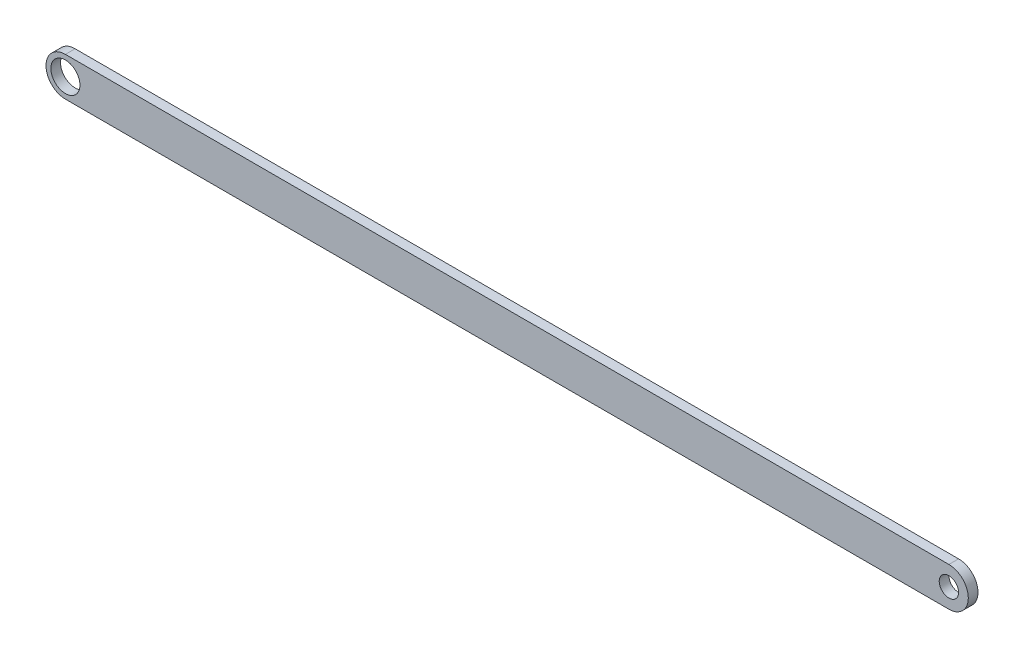
ISO-10303-21;
HEADER;
FILE_DESCRIPTION(('STEP AP214'),'2;1');
FILE_NAME('part.step','',(''),(''),'','','');
FILE_SCHEMA(('AUTOMOTIVE_DESIGN { 1 0 10303 214 1 1 1 1 }'));
ENDSEC;
DATA;
#1=APPLICATION_CONTEXT('core data for automotive mechanical design processes');
#2=APPLICATION_PROTOCOL_DEFINITION('international standard','automotive_design',2000,#1);
#3=PRODUCT_CONTEXT('',#1,'mechanical');
#4=PRODUCT('Part','Part','',(#3));
#5=PRODUCT_RELATED_PRODUCT_CATEGORY('part','',(#4));
#6=PRODUCT_DEFINITION_FORMATION('','',#4);
#7=PRODUCT_DEFINITION_CONTEXT('part definition',#1,'design');
#8=PRODUCT_DEFINITION('design','',#6,#7);
#9=PRODUCT_DEFINITION_SHAPE('','',#8);
#10=(LENGTH_UNIT() NAMED_UNIT(*) SI_UNIT(.MILLI.,.METRE.));
#11=(NAMED_UNIT(*) PLANE_ANGLE_UNIT() SI_UNIT($,.RADIAN.));
#12=(NAMED_UNIT(*) SI_UNIT($,.STERADIAN.) SOLID_ANGLE_UNIT());
#13=UNCERTAINTY_MEASURE_WITH_UNIT(LENGTH_MEASURE(1.E-05),#10,'distance_accuracy_value','');
#14=(GEOMETRIC_REPRESENTATION_CONTEXT(3) GLOBAL_UNCERTAINTY_ASSIGNED_CONTEXT((#13)) GLOBAL_UNIT_ASSIGNED_CONTEXT((#10,
#11,#12)) REPRESENTATION_CONTEXT('',''));
#15=CARTESIAN_POINT('',(0.,0.,0.));
#16=DIRECTION('',(0.,0.,1.));
#17=DIRECTION('',(1.,0.,0.));
#18=AXIS2_PLACEMENT_3D('',#15,#16,#17);
#19=CARTESIAN_POINT('',(45.545,0.,1.));
#20=DIRECTION('',(0.,0.,-1.));
#21=DIRECTION('',(-1.,0.,0.));
#22=AXIS2_PLACEMENT_3D('',#19,#20,#21);
#23=PLANE('',#22);
#24=CARTESIAN_POINT('',(45.545,0.,1.));
#25=DIRECTION('',(0.,0.,1.));
#26=DIRECTION('',(-1.,0.,0.));
#27=AXIS2_PLACEMENT_3D('',#24,#25,#26);
#28=CIRCLE('',#27,2.);
#29=CARTESIAN_POINT('',(45.5449999999999,-2.,1.));
#30=VERTEX_POINT('',#29);
#31=CARTESIAN_POINT('',(45.545,2.,1.));
#32=VERTEX_POINT('',#31);
#33=EDGE_CURVE('E89',#30,#32,#28,.T.);
#34=ORIENTED_EDGE('',*,*,#33,.T.);
#35=DIRECTION('',(-1.,0.,0.));
#36=VECTOR('',#35,1.);
#37=CARTESIAN_POINT('',(-45.545,2.,1.));
#38=LINE('',#37,#36);
#39=CARTESIAN_POINT('',(-45.545,2.,1.));
#40=VERTEX_POINT('',#39);
#41=EDGE_CURVE('E84',#32,#40,#38,.T.);
#42=ORIENTED_EDGE('',*,*,#41,.T.);
#43=CARTESIAN_POINT('',(-45.545,0.,1.));
#44=DIRECTION('',(0.,0.,1.));
#45=DIRECTION('',(1.,0.,0.));
#46=AXIS2_PLACEMENT_3D('',#43,#44,#45);
#47=CIRCLE('',#46,2.);
#48=CARTESIAN_POINT('',(-45.545,-2.,1.));
#49=VERTEX_POINT('',#48);
#50=EDGE_CURVE('E87',#40,#49,#47,.T.);
#51=ORIENTED_EDGE('',*,*,#50,.T.);
#52=DIRECTION('',(1.,0.,0.));
#53=VECTOR('',#52,1.);
#54=CARTESIAN_POINT('',(-45.545,-2.,1.));
#55=LINE('',#54,#53);
#56=EDGE_CURVE('E54',#49,#30,#55,.T.);
#57=ORIENTED_EDGE('',*,*,#56,.T.);
#58=EDGE_LOOP('',(#34,#42,#51,#57));
#59=FACE_BOUND('',#58,.T.);
#60=CARTESIAN_POINT('',(-45.545,0.,1.));
#61=DIRECTION('',(0.,0.,1.));
#62=DIRECTION('',(1.,0.,0.));
#63=AXIS2_PLACEMENT_3D('',#60,#61,#62);
#64=CIRCLE('',#63,1.5);
#65=CARTESIAN_POINT('',(-44.045,0.,1.));
#66=VERTEX_POINT('',#65);
#67=EDGE_CURVE('E104',#66,#66,#64,.T.);
#68=ORIENTED_EDGE('',*,*,#67,.F.);
#69=EDGE_LOOP('',(#68));
#70=FACE_BOUND('',#69,.T.);
#71=CARTESIAN_POINT('',(45.545,0.,1.));
#72=DIRECTION('',(0.,0.,1.));
#73=DIRECTION('',(1.,0.,0.));
#74=AXIS2_PLACEMENT_3D('',#71,#72,#73);
#75=CIRCLE('',#74,0.999999999999998);
#76=CARTESIAN_POINT('',(46.545,0.,1.));
#77=VERTEX_POINT('',#76);
#78=EDGE_CURVE('E119',#77,#77,#75,.T.);
#79=ORIENTED_EDGE('',*,*,#78,.F.);
#80=EDGE_LOOP('',(#79));
#81=FACE_BOUND('',#80,.T.);
#82=ADVANCED_FACE('F37',(#59,#70,#81),#23,.F.);
#83=CARTESIAN_POINT('',(45.545,0.,0.));
#84=DIRECTION('',(0.,0.,-1.));
#85=DIRECTION('',(-1.,0.,0.));
#86=AXIS2_PLACEMENT_3D('',#83,#84,#85);
#87=PLANE('',#86);
#88=CARTESIAN_POINT('',(-45.545,0.,0.));
#89=DIRECTION('',(0.,0.,1.));
#90=DIRECTION('',(1.,0.,0.));
#91=AXIS2_PLACEMENT_3D('',#88,#89,#90);
#92=CIRCLE('',#91,1.5);
#93=CARTESIAN_POINT('',(-44.045,0.,0.));
#94=VERTEX_POINT('',#93);
#95=EDGE_CURVE('E116',#94,#94,#92,.T.);
#96=ORIENTED_EDGE('',*,*,#95,.T.);
#97=EDGE_LOOP('',(#96));
#98=FACE_BOUND('',#97,.T.);
#99=CARTESIAN_POINT('',(45.545,0.,0.));
#100=DIRECTION('',(0.,0.,1.));
#101=DIRECTION('',(-1.,0.,0.));
#102=AXIS2_PLACEMENT_3D('',#99,#100,#101);
#103=CIRCLE('',#102,2.);
#104=CARTESIAN_POINT('',(45.5449999999999,-2.,0.));
#105=VERTEX_POINT('',#104);
#106=CARTESIAN_POINT('',(45.545,2.,0.));
#107=VERTEX_POINT('',#106);
#108=EDGE_CURVE('E101',#105,#107,#103,.T.);
#109=ORIENTED_EDGE('',*,*,#108,.F.);
#110=DIRECTION('',(1.,0.,0.));
#111=VECTOR('',#110,1.);
#112=CARTESIAN_POINT('',(-45.545,-2.,0.));
#113=LINE('',#112,#111);
#114=CARTESIAN_POINT('',(-45.545,-2.,0.));
#115=VERTEX_POINT('',#114);
#116=EDGE_CURVE('E77',#115,#105,#113,.T.);
#117=ORIENTED_EDGE('',*,*,#116,.F.);
#118=CARTESIAN_POINT('',(-45.545,0.,0.));
#119=DIRECTION('',(0.,0.,1.));
#120=DIRECTION('',(1.,0.,0.));
#121=AXIS2_PLACEMENT_3D('',#118,#119,#120);
#122=CIRCLE('',#121,2.);
#123=CARTESIAN_POINT('',(-45.545,2.,0.));
#124=VERTEX_POINT('',#123);
#125=EDGE_CURVE('E71',#124,#115,#122,.T.);
#126=ORIENTED_EDGE('',*,*,#125,.F.);
#127=DIRECTION('',(-1.,0.,0.));
#128=VECTOR('',#127,1.);
#129=CARTESIAN_POINT('',(-45.545,2.,0.));
#130=LINE('',#129,#128);
#131=EDGE_CURVE('E93',#107,#124,#130,.T.);
#132=ORIENTED_EDGE('',*,*,#131,.F.);
#133=EDGE_LOOP('',(#109,#117,#126,#132));
#134=FACE_BOUND('',#133,.T.);
#135=CARTESIAN_POINT('',(45.545,0.,0.));
#136=DIRECTION('',(0.,0.,1.));
#137=DIRECTION('',(1.,0.,0.));
#138=AXIS2_PLACEMENT_3D('',#135,#136,#137);
#139=CIRCLE('',#138,0.999999999999998);
#140=CARTESIAN_POINT('',(46.545,0.,0.));
#141=VERTEX_POINT('',#140);
#142=EDGE_CURVE('E122',#141,#141,#139,.T.);
#143=ORIENTED_EDGE('',*,*,#142,.T.);
#144=EDGE_LOOP('',(#143));
#145=FACE_BOUND('',#144,.T.);
#146=ADVANCED_FACE('F112',(#98,#134,#145),#87,.T.);
#147=CARTESIAN_POINT('',(45.545,0.,1.));
#148=DIRECTION('',(0.,0.,-1.));
#149=DIRECTION('',(-1.,0.,0.));
#150=AXIS2_PLACEMENT_3D('',#147,#148,#149);
#151=CYLINDRICAL_SURFACE('',#150,2.);
#152=ORIENTED_EDGE('',*,*,#108,.T.);
#153=DIRECTION('',(0.,0.,-1.));
#154=VECTOR('',#153,1.);
#155=CARTESIAN_POINT('',(45.545,2.,1.));
#156=LINE('',#155,#154);
#157=EDGE_CURVE('E11',#32,#107,#156,.T.);
#158=ORIENTED_EDGE('',*,*,#157,.F.);
#159=ORIENTED_EDGE('',*,*,#33,.F.);
#160=DIRECTION('',(0.,0.,-1.));
#161=VECTOR('',#160,1.);
#162=CARTESIAN_POINT('',(45.5449999999999,-2.,1.));
#163=LINE('',#162,#161);
#164=EDGE_CURVE('E97',#30,#105,#163,.T.);
#165=ORIENTED_EDGE('',*,*,#164,.T.);
#166=EDGE_LOOP('',(#152,#158,#159,#165));
#167=FACE_BOUND('',#166,.T.);
#168=ADVANCED_FACE('F39',(#167),#151,.T.);
#169=CARTESIAN_POINT('',(-45.545,2.,1.));
#170=DIRECTION('',(0.,-1.,0.));
#171=DIRECTION('',(0.,0.,-1.));
#172=AXIS2_PLACEMENT_3D('',#169,#170,#171);
#173=PLANE('',#172);
#174=ORIENTED_EDGE('',*,*,#131,.T.);
#175=DIRECTION('',(0.,0.,-1.));
#176=VECTOR('',#175,1.);
#177=CARTESIAN_POINT('',(-45.545,2.,1.));
#178=LINE('',#177,#176);
#179=EDGE_CURVE('E46',#40,#124,#178,.T.);
#180=ORIENTED_EDGE('',*,*,#179,.F.);
#181=ORIENTED_EDGE('',*,*,#41,.F.);
#182=ORIENTED_EDGE('',*,*,#157,.T.);
#183=EDGE_LOOP('',(#174,#180,#181,#182));
#184=FACE_BOUND('',#183,.T.);
#185=ADVANCED_FACE('F92',(#184),#173,.F.);
#186=CARTESIAN_POINT('',(-45.545,0.,1.));
#187=DIRECTION('',(0.,0.,-1.));
#188=DIRECTION('',(-1.,0.,0.));
#189=AXIS2_PLACEMENT_3D('',#186,#187,#188);
#190=CYLINDRICAL_SURFACE('',#189,2.);
#191=ORIENTED_EDGE('',*,*,#125,.T.);
#192=DIRECTION('',(0.,0.,-1.));
#193=VECTOR('',#192,1.);
#194=CARTESIAN_POINT('',(-45.545,-2.,1.));
#195=LINE('',#194,#193);
#196=EDGE_CURVE('E94',#49,#115,#195,.T.);
#197=ORIENTED_EDGE('',*,*,#196,.F.);
#198=ORIENTED_EDGE('',*,*,#50,.F.);
#199=ORIENTED_EDGE('',*,*,#179,.T.);
#200=EDGE_LOOP('',(#191,#197,#198,#199));
#201=FACE_BOUND('',#200,.T.);
#202=ADVANCED_FACE('F95',(#201),#190,.T.);
#203=CARTESIAN_POINT('',(-45.545,-2.,1.));
#204=DIRECTION('',(0.,1.,0.));
#205=DIRECTION('',(0.,0.,1.));
#206=AXIS2_PLACEMENT_3D('',#203,#204,#205);
#207=PLANE('',#206);
#208=ORIENTED_EDGE('',*,*,#116,.T.);
#209=ORIENTED_EDGE('',*,*,#164,.F.);
#210=ORIENTED_EDGE('',*,*,#56,.F.);
#211=ORIENTED_EDGE('',*,*,#196,.T.);
#212=EDGE_LOOP('',(#208,#209,#210,#211));
#213=FACE_BOUND('',#212,.T.);
#214=ADVANCED_FACE('F109',(#213),#207,.F.);
#215=CARTESIAN_POINT('',(-45.545,0.,1.));
#216=DIRECTION('',(0.,0.,-1.));
#217=DIRECTION('',(-1.,0.,0.));
#218=AXIS2_PLACEMENT_3D('',#215,#216,#217);
#219=CYLINDRICAL_SURFACE('',#218,1.5);
#220=ORIENTED_EDGE('',*,*,#67,.T.);
#221=EDGE_LOOP('',(#220));
#222=FACE_BOUND('',#221,.T.);
#223=ORIENTED_EDGE('',*,*,#95,.F.);
#224=EDGE_LOOP('',(#223));
#225=FACE_BOUND('',#224,.T.);
#226=ADVANCED_FACE('F139',(#222,#225),#219,.F.);
#227=CARTESIAN_POINT('',(45.545,0.,1.));
#228=DIRECTION('',(0.,0.,-1.));
#229=DIRECTION('',(-1.,0.,0.));
#230=AXIS2_PLACEMENT_3D('',#227,#228,#229);
#231=CYLINDRICAL_SURFACE('',#230,0.999999999999998);
#232=ORIENTED_EDGE('',*,*,#78,.T.);
#233=EDGE_LOOP('',(#232));
#234=FACE_BOUND('',#233,.T.);
#235=ORIENTED_EDGE('',*,*,#142,.F.);
#236=EDGE_LOOP('',(#235));
#237=FACE_BOUND('',#236,.T.);
#238=ADVANCED_FACE('F128',(#234,#237),#231,.F.);
#239=CLOSED_SHELL('',(#82,#146,#168,#185,#202,#214,#226,#238));
#240=MANIFOLD_SOLID_BREP('B2',#239);
#241=ADVANCED_BREP_SHAPE_REPRESENTATION('',(#18,#240),#14);
#242=SHAPE_DEFINITION_REPRESENTATION(#9,#241);
ENDSEC;
END-ISO-10303-21;
